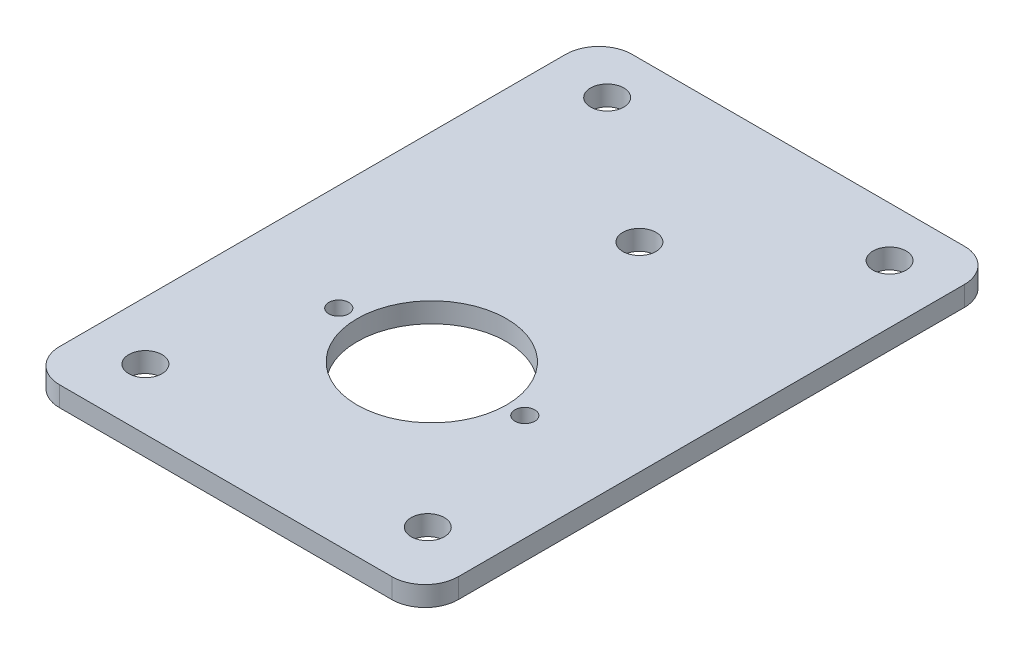
ISO-10303-21;
HEADER;
FILE_DESCRIPTION(('STEP AP214'),'2;1');
FILE_NAME('part.step','',(''),(''),'','','');
FILE_SCHEMA(('AUTOMOTIVE_DESIGN { 1 0 10303 214 1 1 1 1 }'));
ENDSEC;
DATA;
#1=APPLICATION_CONTEXT('core data for automotive mechanical design processes');
#2=APPLICATION_PROTOCOL_DEFINITION('international standard','automotive_design',2000,#1);
#3=PRODUCT_CONTEXT('',#1,'mechanical');
#4=PRODUCT('Part','Part','',(#3));
#5=PRODUCT_RELATED_PRODUCT_CATEGORY('part','',(#4));
#6=PRODUCT_DEFINITION_FORMATION('','',#4);
#7=PRODUCT_DEFINITION_CONTEXT('part definition',#1,'design');
#8=PRODUCT_DEFINITION('design','',#6,#7);
#9=PRODUCT_DEFINITION_SHAPE('','',#8);
#10=(LENGTH_UNIT() NAMED_UNIT(*) SI_UNIT(.MILLI.,.METRE.));
#11=(NAMED_UNIT(*) PLANE_ANGLE_UNIT() SI_UNIT($,.RADIAN.));
#12=(NAMED_UNIT(*) SI_UNIT($,.STERADIAN.) SOLID_ANGLE_UNIT());
#13=UNCERTAINTY_MEASURE_WITH_UNIT(LENGTH_MEASURE(1.E-05),#10,'distance_accuracy_value','');
#14=(GEOMETRIC_REPRESENTATION_CONTEXT(3) GLOBAL_UNCERTAINTY_ASSIGNED_CONTEXT((#13)) GLOBAL_UNIT_ASSIGNED_CONTEXT((#10,
#11,#12)) REPRESENTATION_CONTEXT('',''));
#15=CARTESIAN_POINT('',(0.,0.,0.));
#16=DIRECTION('',(0.,0.,1.));
#17=DIRECTION('',(1.,0.,0.));
#18=AXIS2_PLACEMENT_3D('',#15,#16,#17);
#19=CARTESIAN_POINT('',(60.,6.,90.));
#20=DIRECTION('',(-1.,0.,0.));
#21=DIRECTION('',(0.,0.,1.));
#22=AXIS2_PLACEMENT_3D('',#19,#20,#21);
#23=PLANE('',#22);
#24=DIRECTION('',(0.,0.,-1.));
#25=VECTOR('',#24,1.);
#26=CARTESIAN_POINT('',(60.,6.,90.));
#27=LINE('',#26,#25);
#28=CARTESIAN_POINT('',(60.,6.,72.3019951820349));
#29=VERTEX_POINT('',#28);
#30=CARTESIAN_POINT('',(60.,6.,-80.));
#31=VERTEX_POINT('',#30);
#32=EDGE_CURVE('E153',#29,#31,#27,.T.);
#33=ORIENTED_EDGE('',*,*,#32,.F.);
#34=DIRECTION('',(0.,1.,0.));
#35=VECTOR('',#34,1.);
#36=CARTESIAN_POINT('',(60.,6.,72.3019951820349));
#37=LINE('',#36,#35);
#38=CARTESIAN_POINT('',(60.,0.,72.3019951820349));
#39=VERTEX_POINT('',#38);
#40=EDGE_CURVE('E166',#29,#39,#37,.F.);
#41=ORIENTED_EDGE('',*,*,#40,.T.);
#42=DIRECTION('',(0.,0.,-1.));
#43=VECTOR('',#42,1.);
#44=CARTESIAN_POINT('',(60.,0.,90.));
#45=LINE('',#44,#43);
#46=CARTESIAN_POINT('',(60.,0.,-80.));
#47=VERTEX_POINT('',#46);
#48=EDGE_CURVE('E171',#39,#47,#45,.T.);
#49=ORIENTED_EDGE('',*,*,#48,.T.);
#50=DIRECTION('',(0.,-1.,0.));
#51=VECTOR('',#50,1.);
#52=CARTESIAN_POINT('',(60.,6.,-80.));
#53=LINE('',#52,#51);
#54=EDGE_CURVE('E164',#47,#31,#53,.F.);
#55=ORIENTED_EDGE('',*,*,#54,.T.);
#56=EDGE_LOOP('',(#33,#41,#49,#55));
#57=FACE_BOUND('',#56,.T.);
#58=ADVANCED_FACE('F36',(#57),#23,.F.);
#59=CARTESIAN_POINT('',(-60.,6.,-90.));
#60=DIRECTION('',(0.,0.,1.));
#61=DIRECTION('',(1.,0.,0.));
#62=AXIS2_PLACEMENT_3D('',#59,#60,#61);
#63=PLANE('',#62);
#64=DIRECTION('',(-1.,0.,0.));
#65=VECTOR('',#64,1.);
#66=CARTESIAN_POINT('',(-60.,6.,-90.));
#67=LINE('',#66,#65);
#68=CARTESIAN_POINT('',(50.,6.,-90.));
#69=VERTEX_POINT('',#68);
#70=CARTESIAN_POINT('',(-50.,6.,-90.));
#71=VERTEX_POINT('',#70);
#72=EDGE_CURVE('E141',#69,#71,#67,.T.);
#73=ORIENTED_EDGE('',*,*,#72,.F.);
#74=DIRECTION('',(0.,-1.,0.));
#75=VECTOR('',#74,1.);
#76=CARTESIAN_POINT('',(50.,6.,-90.));
#77=LINE('',#76,#75);
#78=CARTESIAN_POINT('',(50.,0.,-90.));
#79=VERTEX_POINT('',#78);
#80=EDGE_CURVE('E11',#69,#79,#77,.T.);
#81=ORIENTED_EDGE('',*,*,#80,.T.);
#82=DIRECTION('',(-1.,0.,0.));
#83=VECTOR('',#82,1.);
#84=CARTESIAN_POINT('',(-60.,0.,-90.));
#85=LINE('',#84,#83);
#86=CARTESIAN_POINT('',(-50.,0.,-90.));
#87=VERTEX_POINT('',#86);
#88=EDGE_CURVE('E142',#79,#87,#85,.T.);
#89=ORIENTED_EDGE('',*,*,#88,.T.);
#90=DIRECTION('',(0.,-1.,0.));
#91=VECTOR('',#90,1.);
#92=CARTESIAN_POINT('',(-50.,6.,-90.));
#93=LINE('',#92,#91);
#94=EDGE_CURVE('E44',#87,#71,#93,.F.);
#95=ORIENTED_EDGE('',*,*,#94,.T.);
#96=EDGE_LOOP('',(#73,#81,#89,#95));
#97=FACE_BOUND('',#96,.T.);
#98=ADVANCED_FACE('F140',(#97),#63,.F.);
#99=CARTESIAN_POINT('',(-60.,6.,90.));
#100=DIRECTION('',(1.,0.,0.));
#101=DIRECTION('',(0.,0.,-1.));
#102=AXIS2_PLACEMENT_3D('',#99,#100,#101);
#103=PLANE('',#102);
#104=DIRECTION('',(0.,0.,1.));
#105=VECTOR('',#104,1.);
#106=CARTESIAN_POINT('',(-60.,0.,90.));
#107=LINE('',#106,#105);
#108=CARTESIAN_POINT('',(-60.,0.,-80.));
#109=VERTEX_POINT('',#108);
#110=CARTESIAN_POINT('',(-60.,0.,72.3019951820349));
#111=VERTEX_POINT('',#110);
#112=EDGE_CURVE('E218',#109,#111,#107,.T.);
#113=ORIENTED_EDGE('',*,*,#112,.T.);
#114=DIRECTION('',(0.,1.,0.));
#115=VECTOR('',#114,1.);
#116=CARTESIAN_POINT('',(-60.,6.,72.3019951820349));
#117=LINE('',#116,#115);
#118=CARTESIAN_POINT('',(-60.,6.,72.3019951820349));
#119=VERTEX_POINT('',#118);
#120=EDGE_CURVE('E127',#111,#119,#117,.T.);
#121=ORIENTED_EDGE('',*,*,#120,.T.);
#122=DIRECTION('',(0.,0.,1.));
#123=VECTOR('',#122,1.);
#124=CARTESIAN_POINT('',(-60.,6.,90.));
#125=LINE('',#124,#123);
#126=CARTESIAN_POINT('',(-60.,6.,-80.));
#127=VERTEX_POINT('',#126);
#128=EDGE_CURVE('E122',#127,#119,#125,.T.);
#129=ORIENTED_EDGE('',*,*,#128,.F.);
#130=DIRECTION('',(0.,-1.,0.));
#131=VECTOR('',#130,1.);
#132=CARTESIAN_POINT('',(-60.,6.,-80.));
#133=LINE('',#132,#131);
#134=EDGE_CURVE('E129',#127,#109,#133,.T.);
#135=ORIENTED_EDGE('',*,*,#134,.T.);
#136=EDGE_LOOP('',(#113,#121,#129,#135));
#137=FACE_BOUND('',#136,.T.);
#138=ADVANCED_FACE('F258',(#137),#103,.F.);
#139=CARTESIAN_POINT('',(0.,6.,0.));
#140=DIRECTION('',(0.,-1.,0.));
#141=DIRECTION('',(0.,0.,-1.));
#142=AXIS2_PLACEMENT_3D('',#139,#140,#141);
#143=PLANE('',#142);
#144=CARTESIAN_POINT('',(28.,6.,20.3));
#145=DIRECTION('',(0.,1.,0.));
#146=DIRECTION('',(0.,0.,1.));
#147=AXIS2_PLACEMENT_3D('',#144,#145,#146);
#148=CIRCLE('',#147,3.);
#149=CARTESIAN_POINT('',(28.,6.,23.3));
#150=VERTEX_POINT('',#149);
#151=EDGE_CURVE('E176',#150,#150,#148,.T.);
#152=ORIENTED_EDGE('',*,*,#151,.F.);
#153=EDGE_LOOP('',(#152));
#154=FACE_BOUND('',#153,.T.);
#155=CARTESIAN_POINT('',(-28.,6.,20.3));
#156=DIRECTION('',(0.,1.,0.));
#157=DIRECTION('',(0.,0.,1.));
#158=AXIS2_PLACEMENT_3D('',#155,#156,#157);
#159=CIRCLE('',#158,3.);
#160=CARTESIAN_POINT('',(-28.,6.,23.3));
#161=VERTEX_POINT('',#160);
#162=EDGE_CURVE('E179',#161,#161,#159,.T.);
#163=ORIENTED_EDGE('',*,*,#162,.F.);
#164=EDGE_LOOP('',(#163));
#165=FACE_BOUND('',#164,.T.);
#166=CARTESIAN_POINT('',(0.,6.,20.3));
#167=DIRECTION('',(0.,1.,0.));
#168=DIRECTION('',(0.,0.,1.));
#169=AXIS2_PLACEMENT_3D('',#166,#167,#168);
#170=CIRCLE('',#169,22.5);
#171=CARTESIAN_POINT('',(0.,6.,42.8));
#172=VERTEX_POINT('',#171);
#173=EDGE_CURVE('E183',#172,#172,#170,.T.);
#174=ORIENTED_EDGE('',*,*,#173,.F.);
#175=EDGE_LOOP('',(#174));
#176=FACE_BOUND('',#175,.T.);
#177=CARTESIAN_POINT('',(42.5,6.,-75.));
#178=DIRECTION('',(0.,1.,0.));
#179=DIRECTION('',(0.,0.,1.));
#180=AXIS2_PLACEMENT_3D('',#177,#178,#179);
#181=CIRCLE('',#180,5.);
#182=CARTESIAN_POINT('',(42.5,6.,-70.));
#183=VERTEX_POINT('',#182);
#184=EDGE_CURVE('E206',#183,#183,#181,.T.);
#185=ORIENTED_EDGE('',*,*,#184,.F.);
#186=EDGE_LOOP('',(#185));
#187=FACE_BOUND('',#186,.T.);
#188=CARTESIAN_POINT('',(-42.5,6.,64.));
#189=DIRECTION('',(0.,1.,0.));
#190=DIRECTION('',(0.,0.,1.));
#191=AXIS2_PLACEMENT_3D('',#188,#189,#190);
#192=CIRCLE('',#191,5.);
#193=CARTESIAN_POINT('',(-42.5,6.,69.));
#194=VERTEX_POINT('',#193);
#195=EDGE_CURVE('E191',#194,#194,#192,.T.);
#196=ORIENTED_EDGE('',*,*,#195,.F.);
#197=EDGE_LOOP('',(#196));
#198=FACE_BOUND('',#197,.T.);
#199=CARTESIAN_POINT('',(42.5,6.,64.));
#200=DIRECTION('',(0.,1.,0.));
#201=DIRECTION('',(0.,0.,1.));
#202=AXIS2_PLACEMENT_3D('',#199,#200,#201);
#203=CIRCLE('',#202,5.);
#204=CARTESIAN_POINT('',(42.5,6.,69.));
#205=VERTEX_POINT('',#204);
#206=EDGE_CURVE('E192',#205,#205,#203,.T.);
#207=ORIENTED_EDGE('',*,*,#206,.F.);
#208=EDGE_LOOP('',(#207));
#209=FACE_BOUND('',#208,.T.);
#210=CARTESIAN_POINT('',(0.,6.,-42.2));
#211=DIRECTION('',(0.,1.,0.));
#212=DIRECTION('',(0.,0.,1.));
#213=AXIS2_PLACEMENT_3D('',#210,#211,#212);
#214=CIRCLE('',#213,5.);
#215=CARTESIAN_POINT('',(0.,6.,-37.2));
#216=VERTEX_POINT('',#215);
#217=EDGE_CURVE('E198',#216,#216,#214,.T.);
#218=ORIENTED_EDGE('',*,*,#217,.F.);
#219=EDGE_LOOP('',(#218));
#220=FACE_BOUND('',#219,.T.);
#221=CARTESIAN_POINT('',(-42.5,6.,-75.));
#222=DIRECTION('',(0.,1.,0.));
#223=DIRECTION('',(0.,0.,1.));
#224=AXIS2_PLACEMENT_3D('',#221,#222,#223);
#225=CIRCLE('',#224,5.);
#226=CARTESIAN_POINT('',(-42.5,6.,-70.));
#227=VERTEX_POINT('',#226);
#228=EDGE_CURVE('E205',#227,#227,#225,.T.);
#229=ORIENTED_EDGE('',*,*,#228,.F.);
#230=EDGE_LOOP('',(#229));
#231=FACE_BOUND('',#230,.T.);
#232=DIRECTION('',(-1.,0.,0.));
#233=VECTOR('',#232,1.);
#234=CARTESIAN_POINT('',(-60.,6.,82.3019951820349));
#235=LINE('',#234,#233);
#236=CARTESIAN_POINT('',(50.,6.,82.3019951820349));
#237=VERTEX_POINT('',#236);
#238=CARTESIAN_POINT('',(-50.,6.,82.3019951820349));
#239=VERTEX_POINT('',#238);
#240=EDGE_CURVE('E110',#237,#239,#235,.T.);
#241=ORIENTED_EDGE('',*,*,#240,.F.);
#242=CARTESIAN_POINT('',(50.,6.,72.3019951820349));
#243=DIRECTION('',(0.,-1.,0.));
#244=DIRECTION('',(0.,0.,-1.));
#245=AXIS2_PLACEMENT_3D('',#242,#243,#244);
#246=CIRCLE('',#245,10.);
#247=EDGE_CURVE('E162',#237,#29,#246,.F.);
#248=ORIENTED_EDGE('',*,*,#247,.T.);
#249=ORIENTED_EDGE('',*,*,#32,.T.);
#250=CARTESIAN_POINT('',(50.,6.,-80.));
#251=DIRECTION('',(0.,-1.,0.));
#252=DIRECTION('',(0.,0.,-1.));
#253=AXIS2_PLACEMENT_3D('',#250,#251,#252);
#254=CIRCLE('',#253,10.);
#255=EDGE_CURVE('E152',#31,#69,#254,.F.);
#256=ORIENTED_EDGE('',*,*,#255,.T.);
#257=ORIENTED_EDGE('',*,*,#72,.T.);
#258=CARTESIAN_POINT('',(-50.,6.,-80.));
#259=DIRECTION('',(0.,-1.,0.));
#260=DIRECTION('',(0.,0.,-1.));
#261=AXIS2_PLACEMENT_3D('',#258,#259,#260);
#262=CIRCLE('',#261,10.);
#263=EDGE_CURVE('E148',#71,#127,#262,.F.);
#264=ORIENTED_EDGE('',*,*,#263,.T.);
#265=ORIENTED_EDGE('',*,*,#128,.T.);
#266=CARTESIAN_POINT('',(-50.,6.,72.3019951820349));
#267=DIRECTION('',(0.,-1.,0.));
#268=DIRECTION('',(0.,0.,-1.));
#269=AXIS2_PLACEMENT_3D('',#266,#267,#268);
#270=CIRCLE('',#269,10.);
#271=EDGE_CURVE('E157',#119,#239,#270,.F.);
#272=ORIENTED_EDGE('',*,*,#271,.T.);
#273=EDGE_LOOP('',(#241,#248,#249,#256,#257,#264,#265,#272));
#274=FACE_BOUND('',#273,.T.);
#275=ADVANCED_FACE('F146',(#154,#165,#176,#187,#198,#209,#220,#231,#274),#143,.F.);
#276=CARTESIAN_POINT('',(0.,0.,0.));
#277=DIRECTION('',(0.,-1.,0.));
#278=DIRECTION('',(0.,0.,-1.));
#279=AXIS2_PLACEMENT_3D('',#276,#277,#278);
#280=PLANE('',#279);
#281=ORIENTED_EDGE('',*,*,#48,.F.);
#282=CARTESIAN_POINT('',(50.,0.,72.3019951820349));
#283=DIRECTION('',(0.,-1.,0.));
#284=DIRECTION('',(0.,0.,-1.));
#285=AXIS2_PLACEMENT_3D('',#282,#283,#284);
#286=CIRCLE('',#285,10.);
#287=CARTESIAN_POINT('',(50.,0.,82.3019951820349));
#288=VERTEX_POINT('',#287);
#289=EDGE_CURVE('E121',#39,#288,#286,.T.);
#290=ORIENTED_EDGE('',*,*,#289,.T.);
#291=DIRECTION('',(1.,0.,0.));
#292=VECTOR('',#291,1.);
#293=CARTESIAN_POINT('',(0.,0.,82.3019951820349));
#294=LINE('',#293,#292);
#295=CARTESIAN_POINT('',(-50.,0.,82.3019951820349));
#296=VERTEX_POINT('',#295);
#297=EDGE_CURVE('E107',#296,#288,#294,.T.);
#298=ORIENTED_EDGE('',*,*,#297,.F.);
#299=CARTESIAN_POINT('',(-50.,0.,72.3019951820349));
#300=DIRECTION('',(0.,-1.,0.));
#301=DIRECTION('',(0.,0.,-1.));
#302=AXIS2_PLACEMENT_3D('',#299,#300,#301);
#303=CIRCLE('',#302,10.);
#304=EDGE_CURVE('E118',#296,#111,#303,.T.);
#305=ORIENTED_EDGE('',*,*,#304,.T.);
#306=ORIENTED_EDGE('',*,*,#112,.F.);
#307=CARTESIAN_POINT('',(-50.,0.,-80.));
#308=DIRECTION('',(0.,-1.,0.));
#309=DIRECTION('',(0.,0.,-1.));
#310=AXIS2_PLACEMENT_3D('',#307,#308,#309);
#311=CIRCLE('',#310,10.);
#312=EDGE_CURVE('E51',#109,#87,#311,.T.);
#313=ORIENTED_EDGE('',*,*,#312,.T.);
#314=ORIENTED_EDGE('',*,*,#88,.F.);
#315=CARTESIAN_POINT('',(50.,0.,-80.));
#316=DIRECTION('',(0.,-1.,0.));
#317=DIRECTION('',(0.,0.,-1.));
#318=AXIS2_PLACEMENT_3D('',#315,#316,#317);
#319=CIRCLE('',#318,10.);
#320=EDGE_CURVE('E59',#79,#47,#319,.T.);
#321=ORIENTED_EDGE('',*,*,#320,.T.);
#322=EDGE_LOOP('',(#281,#290,#298,#305,#306,#313,#314,#321));
#323=FACE_BOUND('',#322,.T.);
#324=CARTESIAN_POINT('',(28.,0.,20.3));
#325=DIRECTION('',(0.,-1.,0.));
#326=DIRECTION('',(0.,0.,-1.));
#327=AXIS2_PLACEMENT_3D('',#324,#325,#326);
#328=CIRCLE('',#327,3.);
#329=CARTESIAN_POINT('',(28.,0.,17.3));
#330=VERTEX_POINT('',#329);
#331=EDGE_CURVE('E201',#330,#330,#328,.T.);
#332=ORIENTED_EDGE('',*,*,#331,.F.);
#333=EDGE_LOOP('',(#332));
#334=FACE_BOUND('',#333,.T.);
#335=CARTESIAN_POINT('',(-28.,0.,20.3));
#336=DIRECTION('',(0.,-1.,0.));
#337=DIRECTION('',(0.,0.,-1.));
#338=AXIS2_PLACEMENT_3D('',#335,#336,#337);
#339=CIRCLE('',#338,3.);
#340=CARTESIAN_POINT('',(-28.,0.,17.3));
#341=VERTEX_POINT('',#340);
#342=EDGE_CURVE('E225',#341,#341,#339,.T.);
#343=ORIENTED_EDGE('',*,*,#342,.F.);
#344=EDGE_LOOP('',(#343));
#345=FACE_BOUND('',#344,.T.);
#346=CARTESIAN_POINT('',(0.,0.,20.3));
#347=DIRECTION('',(0.,-1.,0.));
#348=DIRECTION('',(0.,0.,-1.));
#349=AXIS2_PLACEMENT_3D('',#346,#347,#348);
#350=CIRCLE('',#349,22.5);
#351=CARTESIAN_POINT('',(0.,0.,-2.2));
#352=VERTEX_POINT('',#351);
#353=EDGE_CURVE('E187',#352,#352,#350,.T.);
#354=ORIENTED_EDGE('',*,*,#353,.F.);
#355=EDGE_LOOP('',(#354));
#356=FACE_BOUND('',#355,.T.);
#357=CARTESIAN_POINT('',(42.5,0.,-75.));
#358=DIRECTION('',(0.,1.,0.));
#359=DIRECTION('',(0.,0.,1.));
#360=AXIS2_PLACEMENT_3D('',#357,#358,#359);
#361=CIRCLE('',#360,5.);
#362=CARTESIAN_POINT('',(42.5,0.,-70.));
#363=VERTEX_POINT('',#362);
#364=EDGE_CURVE('E202',#363,#363,#361,.T.);
#365=ORIENTED_EDGE('',*,*,#364,.T.);
#366=EDGE_LOOP('',(#365));
#367=FACE_BOUND('',#366,.T.);
#368=CARTESIAN_POINT('',(-42.5,0.,64.));
#369=DIRECTION('',(0.,1.,0.));
#370=DIRECTION('',(0.,0.,1.));
#371=AXIS2_PLACEMENT_3D('',#368,#369,#370);
#372=CIRCLE('',#371,5.);
#373=CARTESIAN_POINT('',(-42.5,0.,69.));
#374=VERTEX_POINT('',#373);
#375=EDGE_CURVE('E209',#374,#374,#372,.T.);
#376=ORIENTED_EDGE('',*,*,#375,.T.);
#377=EDGE_LOOP('',(#376));
#378=FACE_BOUND('',#377,.T.);
#379=CARTESIAN_POINT('',(42.5,0.,64.));
#380=DIRECTION('',(0.,1.,0.));
#381=DIRECTION('',(0.,0.,1.));
#382=AXIS2_PLACEMENT_3D('',#379,#380,#381);
#383=CIRCLE('',#382,5.);
#384=CARTESIAN_POINT('',(42.5,0.,69.));
#385=VERTEX_POINT('',#384);
#386=EDGE_CURVE('E188',#385,#385,#383,.T.);
#387=ORIENTED_EDGE('',*,*,#386,.T.);
#388=EDGE_LOOP('',(#387));
#389=FACE_BOUND('',#388,.T.);
#390=CARTESIAN_POINT('',(0.,0.,-42.2));
#391=DIRECTION('',(0.,1.,0.));
#392=DIRECTION('',(0.,0.,1.));
#393=AXIS2_PLACEMENT_3D('',#390,#391,#392);
#394=CIRCLE('',#393,5.);
#395=CARTESIAN_POINT('',(0.,0.,-37.2));
#396=VERTEX_POINT('',#395);
#397=EDGE_CURVE('E195',#396,#396,#394,.T.);
#398=ORIENTED_EDGE('',*,*,#397,.T.);
#399=EDGE_LOOP('',(#398));
#400=FACE_BOUND('',#399,.T.);
#401=CARTESIAN_POINT('',(-42.5,0.,-75.));
#402=DIRECTION('',(0.,1.,0.));
#403=DIRECTION('',(0.,0.,1.));
#404=AXIS2_PLACEMENT_3D('',#401,#402,#403);
#405=CIRCLE('',#404,5.);
#406=CARTESIAN_POINT('',(-42.5,0.,-70.));
#407=VERTEX_POINT('',#406);
#408=EDGE_CURVE('E173',#407,#407,#405,.T.);
#409=ORIENTED_EDGE('',*,*,#408,.T.);
#410=EDGE_LOOP('',(#409));
#411=FACE_BOUND('',#410,.T.);
#412=ADVANCED_FACE('F116',(#323,#334,#345,#356,#367,#378,#389,#400,#411),#280,.T.);
#413=CARTESIAN_POINT('',(-42.5,0.,-75.));
#414=DIRECTION('',(0.,1.,0.));
#415=DIRECTION('',(0.,0.,1.));
#416=AXIS2_PLACEMENT_3D('',#413,#414,#415);
#417=CYLINDRICAL_SURFACE('',#416,5.);
#418=ORIENTED_EDGE('',*,*,#408,.F.);
#419=EDGE_LOOP('',(#418));
#420=FACE_BOUND('',#419,.T.);
#421=ORIENTED_EDGE('',*,*,#228,.T.);
#422=EDGE_LOOP('',(#421));
#423=FACE_BOUND('',#422,.T.);
#424=ADVANCED_FACE('F235',(#420,#423),#417,.F.);
#425=CARTESIAN_POINT('',(0.,0.,-42.2));
#426=DIRECTION('',(0.,1.,0.));
#427=DIRECTION('',(0.,0.,1.));
#428=AXIS2_PLACEMENT_3D('',#425,#426,#427);
#429=CYLINDRICAL_SURFACE('',#428,5.);
#430=ORIENTED_EDGE('',*,*,#397,.F.);
#431=EDGE_LOOP('',(#430));
#432=FACE_BOUND('',#431,.T.);
#433=ORIENTED_EDGE('',*,*,#217,.T.);
#434=EDGE_LOOP('',(#433));
#435=FACE_BOUND('',#434,.T.);
#436=ADVANCED_FACE('F253',(#432,#435),#429,.F.);
#437=CARTESIAN_POINT('',(42.5,0.,64.));
#438=DIRECTION('',(0.,1.,0.));
#439=DIRECTION('',(0.,0.,1.));
#440=AXIS2_PLACEMENT_3D('',#437,#438,#439);
#441=CYLINDRICAL_SURFACE('',#440,5.);
#442=ORIENTED_EDGE('',*,*,#386,.F.);
#443=EDGE_LOOP('',(#442));
#444=FACE_BOUND('',#443,.T.);
#445=ORIENTED_EDGE('',*,*,#206,.T.);
#446=EDGE_LOOP('',(#445));
#447=FACE_BOUND('',#446,.T.);
#448=ADVANCED_FACE('F384',(#444,#447),#441,.F.);
#449=CARTESIAN_POINT('',(-42.5,0.,64.));
#450=DIRECTION('',(0.,1.,0.));
#451=DIRECTION('',(0.,0.,1.));
#452=AXIS2_PLACEMENT_3D('',#449,#450,#451);
#453=CYLINDRICAL_SURFACE('',#452,5.);
#454=ORIENTED_EDGE('',*,*,#375,.F.);
#455=EDGE_LOOP('',(#454));
#456=FACE_BOUND('',#455,.T.);
#457=ORIENTED_EDGE('',*,*,#195,.T.);
#458=EDGE_LOOP('',(#457));
#459=FACE_BOUND('',#458,.T.);
#460=ADVANCED_FACE('F374',(#456,#459),#453,.F.);
#461=CARTESIAN_POINT('',(42.5,0.,-75.));
#462=DIRECTION('',(0.,1.,0.));
#463=DIRECTION('',(0.,0.,1.));
#464=AXIS2_PLACEMENT_3D('',#461,#462,#463);
#465=CYLINDRICAL_SURFACE('',#464,5.);
#466=ORIENTED_EDGE('',*,*,#364,.F.);
#467=EDGE_LOOP('',(#466));
#468=FACE_BOUND('',#467,.T.);
#469=ORIENTED_EDGE('',*,*,#184,.T.);
#470=EDGE_LOOP('',(#469));
#471=FACE_BOUND('',#470,.T.);
#472=ADVANCED_FACE('F364',(#468,#471),#465,.F.);
#473=CARTESIAN_POINT('',(0.,-4.,20.3));
#474=DIRECTION('',(0.,1.,0.));
#475=DIRECTION('',(0.,0.,1.));
#476=AXIS2_PLACEMENT_3D('',#473,#474,#475);
#477=CYLINDRICAL_SURFACE('',#476,22.5);
#478=ORIENTED_EDGE('',*,*,#353,.T.);
#479=EDGE_LOOP('',(#478));
#480=FACE_BOUND('',#479,.T.);
#481=ORIENTED_EDGE('',*,*,#173,.T.);
#482=EDGE_LOOP('',(#481));
#483=FACE_BOUND('',#482,.T.);
#484=ADVANCED_FACE('F354',(#480,#483),#477,.F.);
#485=CARTESIAN_POINT('',(-28.,-4.,20.3));
#486=DIRECTION('',(0.,1.,0.));
#487=DIRECTION('',(0.,0.,1.));
#488=AXIS2_PLACEMENT_3D('',#485,#486,#487);
#489=CYLINDRICAL_SURFACE('',#488,3.);
#490=ORIENTED_EDGE('',*,*,#342,.T.);
#491=EDGE_LOOP('',(#490));
#492=FACE_BOUND('',#491,.T.);
#493=ORIENTED_EDGE('',*,*,#162,.T.);
#494=EDGE_LOOP('',(#493));
#495=FACE_BOUND('',#494,.T.);
#496=ADVANCED_FACE('F345',(#492,#495),#489,.F.);
#497=CARTESIAN_POINT('',(28.,-4.,20.3));
#498=DIRECTION('',(0.,1.,0.));
#499=DIRECTION('',(0.,0.,1.));
#500=AXIS2_PLACEMENT_3D('',#497,#498,#499);
#501=CYLINDRICAL_SURFACE('',#500,3.);
#502=ORIENTED_EDGE('',*,*,#331,.T.);
#503=EDGE_LOOP('',(#502));
#504=FACE_BOUND('',#503,.T.);
#505=ORIENTED_EDGE('',*,*,#151,.T.);
#506=EDGE_LOOP('',(#505));
#507=FACE_BOUND('',#506,.T.);
#508=ADVANCED_FACE('F231',(#504,#507),#501,.F.);
#509=CARTESIAN_POINT('',(-60.,-4.,82.3019951820349));
#510=DIRECTION('',(0.,0.,-1.));
#511=DIRECTION('',(-1.,0.,0.));
#512=AXIS2_PLACEMENT_3D('',#509,#510,#511);
#513=PLANE('',#512);
#514=ORIENTED_EDGE('',*,*,#297,.T.);
#515=DIRECTION('',(0.,1.,0.));
#516=VECTOR('',#515,1.);
#517=CARTESIAN_POINT('',(50.,-4.,82.3019951820349));
#518=LINE('',#517,#516);
#519=EDGE_CURVE('E113',#288,#237,#518,.T.);
#520=ORIENTED_EDGE('',*,*,#519,.T.);
#521=ORIENTED_EDGE('',*,*,#240,.T.);
#522=DIRECTION('',(0.,1.,0.));
#523=VECTOR('',#522,1.);
#524=CARTESIAN_POINT('',(-50.,-4.,82.3019951820349));
#525=LINE('',#524,#523);
#526=EDGE_CURVE('E103',#239,#296,#525,.F.);
#527=ORIENTED_EDGE('',*,*,#526,.T.);
#528=EDGE_LOOP('',(#514,#520,#521,#527));
#529=FACE_BOUND('',#528,.T.);
#530=ADVANCED_FACE('F105',(#529),#513,.F.);
#531=CARTESIAN_POINT('',(50.,-4.,72.3019951820349));
#532=DIRECTION('',(0.,1.,0.));
#533=DIRECTION('',(0.,0.,1.));
#534=AXIS2_PLACEMENT_3D('',#531,#532,#533);
#535=CYLINDRICAL_SURFACE('',#534,10.);
#536=ORIENTED_EDGE('',*,*,#289,.F.);
#537=ORIENTED_EDGE('',*,*,#40,.F.);
#538=ORIENTED_EDGE('',*,*,#247,.F.);
#539=ORIENTED_EDGE('',*,*,#519,.F.);
#540=EDGE_LOOP('',(#536,#537,#538,#539));
#541=FACE_BOUND('',#540,.T.);
#542=ADVANCED_FACE('F175',(#541),#535,.T.);
#543=CARTESIAN_POINT('',(-50.,6.,72.3019951820349));
#544=DIRECTION('',(0.,1.,0.));
#545=DIRECTION('',(0.,0.,1.));
#546=AXIS2_PLACEMENT_3D('',#543,#544,#545);
#547=CYLINDRICAL_SURFACE('',#546,10.);
#548=ORIENTED_EDGE('',*,*,#304,.F.);
#549=ORIENTED_EDGE('',*,*,#526,.F.);
#550=ORIENTED_EDGE('',*,*,#271,.F.);
#551=ORIENTED_EDGE('',*,*,#120,.F.);
#552=EDGE_LOOP('',(#548,#549,#550,#551));
#553=FACE_BOUND('',#552,.T.);
#554=ADVANCED_FACE('F125',(#553),#547,.T.);
#555=CARTESIAN_POINT('',(50.,6.,-80.));
#556=DIRECTION('',(0.,-1.,0.));
#557=DIRECTION('',(0.,0.,-1.));
#558=AXIS2_PLACEMENT_3D('',#555,#556,#557);
#559=CYLINDRICAL_SURFACE('',#558,10.);
#560=ORIENTED_EDGE('',*,*,#255,.F.);
#561=ORIENTED_EDGE('',*,*,#54,.F.);
#562=ORIENTED_EDGE('',*,*,#320,.F.);
#563=ORIENTED_EDGE('',*,*,#80,.F.);
#564=EDGE_LOOP('',(#560,#561,#562,#563));
#565=FACE_BOUND('',#564,.T.);
#566=ADVANCED_FACE('F278',(#565),#559,.T.);
#567=CARTESIAN_POINT('',(-50.,6.,-80.));
#568=DIRECTION('',(0.,-1.,0.));
#569=DIRECTION('',(0.,0.,-1.));
#570=AXIS2_PLACEMENT_3D('',#567,#568,#569);
#571=CYLINDRICAL_SURFACE('',#570,10.);
#572=ORIENTED_EDGE('',*,*,#263,.F.);
#573=ORIENTED_EDGE('',*,*,#94,.F.);
#574=ORIENTED_EDGE('',*,*,#312,.F.);
#575=ORIENTED_EDGE('',*,*,#134,.F.);
#576=EDGE_LOOP('',(#572,#573,#574,#575));
#577=FACE_BOUND('',#576,.T.);
#578=ADVANCED_FACE('F38',(#577),#571,.T.);
#579=CLOSED_SHELL('',(#58,#98,#138,#275,#412,#424,#436,#448,#460,#472,#484,#496,#508,#530,#542,
#554,#566,#578));
#580=MANIFOLD_SOLID_BREP('B2',#579);
#581=ADVANCED_BREP_SHAPE_REPRESENTATION('',(#18,#580),#14);
#582=SHAPE_DEFINITION_REPRESENTATION(#9,#581);
ENDSEC;
END-ISO-10303-21;
